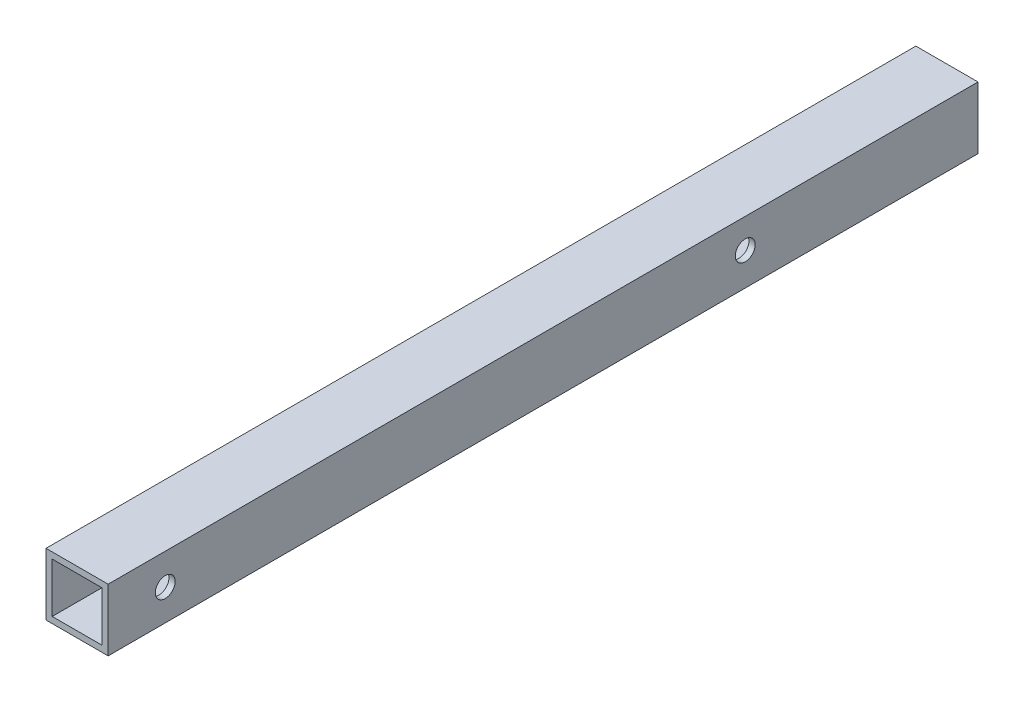
ISO-10303-21;
HEADER;
FILE_DESCRIPTION(('STEP AP214'),'2;1');
FILE_NAME('part.step','',(''),(''),'','','');
FILE_SCHEMA(('AUTOMOTIVE_DESIGN { 1 0 10303 214 1 1 1 1 }'));
ENDSEC;
DATA;
#1=APPLICATION_CONTEXT('core data for automotive mechanical design processes');
#2=APPLICATION_PROTOCOL_DEFINITION('international standard','automotive_design',2000,#1);
#3=PRODUCT_CONTEXT('',#1,'mechanical');
#4=PRODUCT('Part','Part','',(#3));
#5=PRODUCT_RELATED_PRODUCT_CATEGORY('part','',(#4));
#6=PRODUCT_DEFINITION_FORMATION('','',#4);
#7=PRODUCT_DEFINITION_CONTEXT('part definition',#1,'design');
#8=PRODUCT_DEFINITION('design','',#6,#7);
#9=PRODUCT_DEFINITION_SHAPE('','',#8);
#10=(LENGTH_UNIT() NAMED_UNIT(*) SI_UNIT(.MILLI.,.METRE.));
#11=(NAMED_UNIT(*) PLANE_ANGLE_UNIT() SI_UNIT($,.RADIAN.));
#12=(NAMED_UNIT(*) SI_UNIT($,.STERADIAN.) SOLID_ANGLE_UNIT());
#13=UNCERTAINTY_MEASURE_WITH_UNIT(LENGTH_MEASURE(1.E-05),#10,'distance_accuracy_value','');
#14=(GEOMETRIC_REPRESENTATION_CONTEXT(3) GLOBAL_UNCERTAINTY_ASSIGNED_CONTEXT((#13)) GLOBAL_UNIT_ASSIGNED_CONTEXT((#10,
#11,#12)) REPRESENTATION_CONTEXT('',''));
#15=CARTESIAN_POINT('',(0.,0.,0.));
#16=DIRECTION('',(0.,0.,1.));
#17=DIRECTION('',(1.,0.,0.));
#18=AXIS2_PLACEMENT_3D('',#15,#16,#17);
#19=CARTESIAN_POINT('',(0.,0.,140.));
#20=DIRECTION('',(0.,0.,1.));
#21=DIRECTION('',(1.,0.,0.));
#22=AXIS2_PLACEMENT_3D('',#19,#20,#21);
#23=PLANE('',#22);
#24=DIRECTION('',(0.,1.,0.));
#25=VECTOR('',#24,1.);
#26=CARTESIAN_POINT('',(5.,5.,140.));
#27=LINE('',#26,#25);
#28=CARTESIAN_POINT('',(5.,-5.,140.));
#29=VERTEX_POINT('',#28);
#30=CARTESIAN_POINT('',(5.,5.,140.));
#31=VERTEX_POINT('',#30);
#32=EDGE_CURVE('E140',#29,#31,#27,.T.);
#33=ORIENTED_EDGE('',*,*,#32,.T.);
#34=DIRECTION('',(-1.,0.,0.));
#35=VECTOR('',#34,1.);
#36=CARTESIAN_POINT('',(-5.,5.,140.));
#37=LINE('',#36,#35);
#38=CARTESIAN_POINT('',(-5.,5.,140.));
#39=VERTEX_POINT('',#38);
#40=EDGE_CURVE('E143',#31,#39,#37,.T.);
#41=ORIENTED_EDGE('',*,*,#40,.T.);
#42=DIRECTION('',(0.,-1.,0.));
#43=VECTOR('',#42,1.);
#44=CARTESIAN_POINT('',(-5.,5.,140.));
#45=LINE('',#44,#43);
#46=CARTESIAN_POINT('',(-5.,-5.,140.));
#47=VERTEX_POINT('',#46);
#48=EDGE_CURVE('E146',#39,#47,#45,.T.);
#49=ORIENTED_EDGE('',*,*,#48,.T.);
#50=DIRECTION('',(1.,0.,0.));
#51=VECTOR('',#50,1.);
#52=CARTESIAN_POINT('',(-5.,-5.,140.));
#53=LINE('',#52,#51);
#54=EDGE_CURVE('E148',#47,#29,#53,.T.);
#55=ORIENTED_EDGE('',*,*,#54,.T.);
#56=EDGE_LOOP('',(#33,#41,#49,#55));
#57=FACE_BOUND('',#56,.T.);
#58=DIRECTION('',(0.,-1.,0.));
#59=VECTOR('',#58,1.);
#60=CARTESIAN_POINT('',(-4.,4.,140.));
#61=LINE('',#60,#59);
#62=CARTESIAN_POINT('',(-4.,4.,140.));
#63=VERTEX_POINT('',#62);
#64=CARTESIAN_POINT('',(-4.,-4.,140.));
#65=VERTEX_POINT('',#64);
#66=EDGE_CURVE('E110',#63,#65,#61,.T.);
#67=ORIENTED_EDGE('',*,*,#66,.F.);
#68=DIRECTION('',(-1.,0.,0.));
#69=VECTOR('',#68,1.);
#70=CARTESIAN_POINT('',(-4.,4.,140.));
#71=LINE('',#70,#69);
#72=CARTESIAN_POINT('',(4.,4.,140.));
#73=VERTEX_POINT('',#72);
#74=EDGE_CURVE('E102',#73,#63,#71,.T.);
#75=ORIENTED_EDGE('',*,*,#74,.F.);
#76=DIRECTION('',(0.,1.,0.));
#77=VECTOR('',#76,1.);
#78=CARTESIAN_POINT('',(4.,4.,140.));
#79=LINE('',#78,#77);
#80=CARTESIAN_POINT('',(4.,-4.,140.));
#81=VERTEX_POINT('',#80);
#82=EDGE_CURVE('E124',#81,#73,#79,.T.);
#83=ORIENTED_EDGE('',*,*,#82,.F.);
#84=DIRECTION('',(1.,0.,0.));
#85=VECTOR('',#84,1.);
#86=CARTESIAN_POINT('',(-4.,-4.,140.));
#87=LINE('',#86,#85);
#88=EDGE_CURVE('E122',#65,#81,#87,.T.);
#89=ORIENTED_EDGE('',*,*,#88,.F.);
#90=EDGE_LOOP('',(#67,#75,#83,#89));
#91=FACE_BOUND('',#90,.T.);
#92=ADVANCED_FACE('F35',(#57,#91),#23,.T.);
#93=CARTESIAN_POINT('',(0.,0.,0.));
#94=DIRECTION('',(0.,0.,1.));
#95=DIRECTION('',(1.,0.,0.));
#96=AXIS2_PLACEMENT_3D('',#93,#94,#95);
#97=PLANE('',#96);
#98=DIRECTION('',(0.,1.,0.));
#99=VECTOR('',#98,1.);
#100=CARTESIAN_POINT('',(5.,5.,0.));
#101=LINE('',#100,#99);
#102=CARTESIAN_POINT('',(5.,-5.,0.));
#103=VERTEX_POINT('',#102);
#104=CARTESIAN_POINT('',(5.,5.,0.));
#105=VERTEX_POINT('',#104);
#106=EDGE_CURVE('E118',#103,#105,#101,.T.);
#107=ORIENTED_EDGE('',*,*,#106,.F.);
#108=DIRECTION('',(1.,0.,0.));
#109=VECTOR('',#108,1.);
#110=CARTESIAN_POINT('',(-5.,-5.,0.));
#111=LINE('',#110,#109);
#112=CARTESIAN_POINT('',(-5.,-5.,0.));
#113=VERTEX_POINT('',#112);
#114=EDGE_CURVE('E144',#113,#103,#111,.T.);
#115=ORIENTED_EDGE('',*,*,#114,.F.);
#116=DIRECTION('',(0.,-1.,0.));
#117=VECTOR('',#116,1.);
#118=CARTESIAN_POINT('',(-5.,5.,0.));
#119=LINE('',#118,#117);
#120=CARTESIAN_POINT('',(-5.,5.,0.));
#121=VERTEX_POINT('',#120);
#122=EDGE_CURVE('E155',#121,#113,#119,.T.);
#123=ORIENTED_EDGE('',*,*,#122,.F.);
#124=DIRECTION('',(-1.,0.,0.));
#125=VECTOR('',#124,1.);
#126=CARTESIAN_POINT('',(-5.,5.,0.));
#127=LINE('',#126,#125);
#128=EDGE_CURVE('E153',#105,#121,#127,.T.);
#129=ORIENTED_EDGE('',*,*,#128,.F.);
#130=EDGE_LOOP('',(#107,#115,#123,#129));
#131=FACE_BOUND('',#130,.T.);
#132=DIRECTION('',(-1.,0.,0.));
#133=VECTOR('',#132,1.);
#134=CARTESIAN_POINT('',(-4.,4.,0.));
#135=LINE('',#134,#133);
#136=CARTESIAN_POINT('',(4.,4.,0.));
#137=VERTEX_POINT('',#136);
#138=CARTESIAN_POINT('',(-4.,4.,0.));
#139=VERTEX_POINT('',#138);
#140=EDGE_CURVE('E60',#137,#139,#135,.T.);
#141=ORIENTED_EDGE('',*,*,#140,.T.);
#142=DIRECTION('',(0.,-1.,0.));
#143=VECTOR('',#142,1.);
#144=CARTESIAN_POINT('',(-4.,4.,0.));
#145=LINE('',#144,#143);
#146=CARTESIAN_POINT('',(-4.,-4.,0.));
#147=VERTEX_POINT('',#146);
#148=EDGE_CURVE('E117',#139,#147,#145,.T.);
#149=ORIENTED_EDGE('',*,*,#148,.T.);
#150=DIRECTION('',(1.,0.,0.));
#151=VECTOR('',#150,1.);
#152=CARTESIAN_POINT('',(-4.,-4.,0.));
#153=LINE('',#152,#151);
#154=CARTESIAN_POINT('',(4.,-4.,0.));
#155=VERTEX_POINT('',#154);
#156=EDGE_CURVE('E132',#147,#155,#153,.T.);
#157=ORIENTED_EDGE('',*,*,#156,.T.);
#158=DIRECTION('',(0.,1.,0.));
#159=VECTOR('',#158,1.);
#160=CARTESIAN_POINT('',(4.,4.,0.));
#161=LINE('',#160,#159);
#162=EDGE_CURVE('E111',#155,#137,#161,.T.);
#163=ORIENTED_EDGE('',*,*,#162,.T.);
#164=EDGE_LOOP('',(#141,#149,#157,#163));
#165=FACE_BOUND('',#164,.T.);
#166=ADVANCED_FACE('F202',(#131,#165),#97,.F.);
#167=CARTESIAN_POINT('',(5.,5.,140.));
#168=DIRECTION('',(-1.,0.,0.));
#169=DIRECTION('',(0.,-1.,0.));
#170=AXIS2_PLACEMENT_3D('',#167,#168,#169);
#171=PLANE('',#170);
#172=CARTESIAN_POINT('',(5.,0.258526647001551,37.4651202136092));
#173=DIRECTION('',(1.,0.,0.));
#174=DIRECTION('',(0.,1.,0.));
#175=AXIS2_PLACEMENT_3D('',#172,#173,#174);
#176=CIRCLE('',#175,1.59999999999999);
#177=CARTESIAN_POINT('',(5.,1.85852664700154,37.4651202136092));
#178=VERTEX_POINT('',#177);
#179=EDGE_CURVE('E181',#178,#178,#176,.T.);
#180=ORIENTED_EDGE('',*,*,#179,.F.);
#181=EDGE_LOOP('',(#180));
#182=FACE_BOUND('',#181,.T.);
#183=CARTESIAN_POINT('',(5.,0.,130.81));
#184=DIRECTION('',(1.,0.,0.));
#185=DIRECTION('',(0.,1.,0.));
#186=AXIS2_PLACEMENT_3D('',#183,#184,#185);
#187=CIRCLE('',#186,1.60000000000002);
#188=CARTESIAN_POINT('',(5.,1.60000000000002,130.81));
#189=VERTEX_POINT('',#188);
#190=EDGE_CURVE('E171',#189,#189,#187,.T.);
#191=ORIENTED_EDGE('',*,*,#190,.F.);
#192=EDGE_LOOP('',(#191));
#193=FACE_BOUND('',#192,.T.);
#194=ORIENTED_EDGE('',*,*,#106,.T.);
#195=DIRECTION('',(0.,0.,-1.));
#196=VECTOR('',#195,1.);
#197=CARTESIAN_POINT('',(5.,5.,140.));
#198=LINE('',#197,#196);
#199=EDGE_CURVE('E11',#31,#105,#198,.T.);
#200=ORIENTED_EDGE('',*,*,#199,.F.);
#201=ORIENTED_EDGE('',*,*,#32,.F.);
#202=DIRECTION('',(0.,0.,-1.));
#203=VECTOR('',#202,1.);
#204=CARTESIAN_POINT('',(5.,-5.,140.));
#205=LINE('',#204,#203);
#206=EDGE_CURVE('E150',#29,#103,#205,.T.);
#207=ORIENTED_EDGE('',*,*,#206,.T.);
#208=EDGE_LOOP('',(#194,#200,#201,#207));
#209=FACE_BOUND('',#208,.T.);
#210=ADVANCED_FACE('F37',(#182,#193,#209),#171,.F.);
#211=CARTESIAN_POINT('',(-5.,5.,140.));
#212=DIRECTION('',(0.,-1.,0.));
#213=DIRECTION('',(0.,0.,-1.));
#214=AXIS2_PLACEMENT_3D('',#211,#212,#213);
#215=PLANE('',#214);
#216=ORIENTED_EDGE('',*,*,#128,.T.);
#217=DIRECTION('',(0.,0.,-1.));
#218=VECTOR('',#217,1.);
#219=CARTESIAN_POINT('',(-5.,5.,140.));
#220=LINE('',#219,#218);
#221=EDGE_CURVE('E44',#39,#121,#220,.T.);
#222=ORIENTED_EDGE('',*,*,#221,.F.);
#223=ORIENTED_EDGE('',*,*,#40,.F.);
#224=ORIENTED_EDGE('',*,*,#199,.T.);
#225=EDGE_LOOP('',(#216,#222,#223,#224));
#226=FACE_BOUND('',#225,.T.);
#227=ADVANCED_FACE('F229',(#226),#215,.F.);
#228=CARTESIAN_POINT('',(-5.,5.,140.));
#229=DIRECTION('',(1.,0.,0.));
#230=DIRECTION('',(0.,1.,0.));
#231=AXIS2_PLACEMENT_3D('',#228,#229,#230);
#232=PLANE('',#231);
#233=CARTESIAN_POINT('',(-5.00000000000001,0.258526647001549,37.4651202136092));
#234=DIRECTION('',(1.,0.,0.));
#235=DIRECTION('',(0.,1.,0.));
#236=AXIS2_PLACEMENT_3D('',#233,#234,#235);
#237=CIRCLE('',#236,1.59999999999999);
#238=CARTESIAN_POINT('',(-5.00000000000001,1.85852664700154,37.4651202136092));
#239=VERTEX_POINT('',#238);
#240=EDGE_CURVE('E184',#239,#239,#237,.T.);
#241=ORIENTED_EDGE('',*,*,#240,.T.);
#242=EDGE_LOOP('',(#241));
#243=FACE_BOUND('',#242,.T.);
#244=CARTESIAN_POINT('',(-5.,0.,130.81));
#245=DIRECTION('',(1.,0.,0.));
#246=DIRECTION('',(0.,1.,0.));
#247=AXIS2_PLACEMENT_3D('',#244,#245,#246);
#248=CIRCLE('',#247,1.60000000000002);
#249=CARTESIAN_POINT('',(-5.,1.60000000000002,130.81));
#250=VERTEX_POINT('',#249);
#251=EDGE_CURVE('E166',#250,#250,#248,.T.);
#252=ORIENTED_EDGE('',*,*,#251,.T.);
#253=EDGE_LOOP('',(#252));
#254=FACE_BOUND('',#253,.T.);
#255=ORIENTED_EDGE('',*,*,#122,.T.);
#256=DIRECTION('',(0.,0.,-1.));
#257=VECTOR('',#256,1.);
#258=CARTESIAN_POINT('',(-5.,-5.,140.));
#259=LINE('',#258,#257);
#260=EDGE_CURVE('E160',#47,#113,#259,.T.);
#261=ORIENTED_EDGE('',*,*,#260,.F.);
#262=ORIENTED_EDGE('',*,*,#48,.F.);
#263=ORIENTED_EDGE('',*,*,#221,.T.);
#264=EDGE_LOOP('',(#255,#261,#262,#263));
#265=FACE_BOUND('',#264,.T.);
#266=ADVANCED_FACE('F226',(#243,#254,#265),#232,.F.);
#267=CARTESIAN_POINT('',(-5.,-5.,140.));
#268=DIRECTION('',(0.,1.,0.));
#269=DIRECTION('',(0.,0.,1.));
#270=AXIS2_PLACEMENT_3D('',#267,#268,#269);
#271=PLANE('',#270);
#272=ORIENTED_EDGE('',*,*,#114,.T.);
#273=ORIENTED_EDGE('',*,*,#206,.F.);
#274=ORIENTED_EDGE('',*,*,#54,.F.);
#275=ORIENTED_EDGE('',*,*,#260,.T.);
#276=EDGE_LOOP('',(#272,#273,#274,#275));
#277=FACE_BOUND('',#276,.T.);
#278=ADVANCED_FACE('F223',(#277),#271,.F.);
#279=CARTESIAN_POINT('',(-4.,4.,140.));
#280=DIRECTION('',(0.,-1.,0.));
#281=DIRECTION('',(0.,0.,-1.));
#282=AXIS2_PLACEMENT_3D('',#279,#280,#281);
#283=PLANE('',#282);
#284=ORIENTED_EDGE('',*,*,#140,.F.);
#285=DIRECTION('',(0.,0.,-1.));
#286=VECTOR('',#285,1.);
#287=CARTESIAN_POINT('',(4.,4.,140.));
#288=LINE('',#287,#286);
#289=EDGE_CURVE('E106',#73,#137,#288,.T.);
#290=ORIENTED_EDGE('',*,*,#289,.F.);
#291=ORIENTED_EDGE('',*,*,#74,.T.);
#292=DIRECTION('',(0.,0.,-1.));
#293=VECTOR('',#292,1.);
#294=CARTESIAN_POINT('',(-4.,4.,140.));
#295=LINE('',#294,#293);
#296=EDGE_CURVE('E105',#63,#139,#295,.T.);
#297=ORIENTED_EDGE('',*,*,#296,.T.);
#298=EDGE_LOOP('',(#284,#290,#291,#297));
#299=FACE_BOUND('',#298,.T.);
#300=ADVANCED_FACE('F104',(#299),#283,.T.);
#301=CARTESIAN_POINT('',(-4.,4.,140.));
#302=DIRECTION('',(1.,0.,0.));
#303=DIRECTION('',(0.,1.,0.));
#304=AXIS2_PLACEMENT_3D('',#301,#302,#303);
#305=PLANE('',#304);
#306=CARTESIAN_POINT('',(-4.,0.258526647001549,37.4651202136092));
#307=DIRECTION('',(1.,0.,0.));
#308=DIRECTION('',(0.,1.,0.));
#309=AXIS2_PLACEMENT_3D('',#306,#307,#308);
#310=CIRCLE('',#309,1.59999999999999);
#311=CARTESIAN_POINT('',(-4.,1.85852664700154,37.4651202136092));
#312=VERTEX_POINT('',#311);
#313=EDGE_CURVE('E176',#312,#312,#310,.T.);
#314=ORIENTED_EDGE('',*,*,#313,.F.);
#315=EDGE_LOOP('',(#314));
#316=FACE_BOUND('',#315,.T.);
#317=CARTESIAN_POINT('',(-4.,0.,130.81));
#318=DIRECTION('',(1.,0.,0.));
#319=DIRECTION('',(0.,1.,0.));
#320=AXIS2_PLACEMENT_3D('',#317,#318,#319);
#321=CIRCLE('',#320,1.60000000000002);
#322=CARTESIAN_POINT('',(-4.,1.60000000000002,130.81));
#323=VERTEX_POINT('',#322);
#324=EDGE_CURVE('E130',#323,#323,#321,.T.);
#325=ORIENTED_EDGE('',*,*,#324,.F.);
#326=EDGE_LOOP('',(#325));
#327=FACE_BOUND('',#326,.T.);
#328=ORIENTED_EDGE('',*,*,#148,.F.);
#329=ORIENTED_EDGE('',*,*,#296,.F.);
#330=ORIENTED_EDGE('',*,*,#66,.T.);
#331=DIRECTION('',(0.,0.,-1.));
#332=VECTOR('',#331,1.);
#333=CARTESIAN_POINT('',(-4.,-4.,140.));
#334=LINE('',#333,#332);
#335=EDGE_CURVE('E119',#65,#147,#334,.T.);
#336=ORIENTED_EDGE('',*,*,#335,.T.);
#337=EDGE_LOOP('',(#328,#329,#330,#336));
#338=FACE_BOUND('',#337,.T.);
#339=ADVANCED_FACE('F114',(#316,#327,#338),#305,.T.);
#340=CARTESIAN_POINT('',(-4.,-4.,140.));
#341=DIRECTION('',(0.,1.,0.));
#342=DIRECTION('',(-1.,0.,0.));
#343=AXIS2_PLACEMENT_3D('',#340,#341,#342);
#344=PLANE('',#343);
#345=ORIENTED_EDGE('',*,*,#156,.F.);
#346=ORIENTED_EDGE('',*,*,#335,.F.);
#347=ORIENTED_EDGE('',*,*,#88,.T.);
#348=DIRECTION('',(0.,0.,-1.));
#349=VECTOR('',#348,1.);
#350=CARTESIAN_POINT('',(4.,-4.,140.));
#351=LINE('',#350,#349);
#352=EDGE_CURVE('E52',#81,#155,#351,.T.);
#353=ORIENTED_EDGE('',*,*,#352,.T.);
#354=EDGE_LOOP('',(#345,#346,#347,#353));
#355=FACE_BOUND('',#354,.T.);
#356=ADVANCED_FACE('F198',(#355),#344,.T.);
#357=CARTESIAN_POINT('',(4.,4.,140.));
#358=DIRECTION('',(-1.,0.,0.));
#359=DIRECTION('',(0.,-1.,0.));
#360=AXIS2_PLACEMENT_3D('',#357,#358,#359);
#361=PLANE('',#360);
#362=CARTESIAN_POINT('',(4.,0.25852664700155,37.4651202136092));
#363=DIRECTION('',(-1.,0.,0.));
#364=DIRECTION('',(0.,-1.,0.));
#365=AXIS2_PLACEMENT_3D('',#362,#363,#364);
#366=CIRCLE('',#365,1.59999999999999);
#367=CARTESIAN_POINT('',(4.,-1.34147335299844,37.4651202136092));
#368=VERTEX_POINT('',#367);
#369=EDGE_CURVE('E39',#368,#368,#366,.T.);
#370=ORIENTED_EDGE('',*,*,#369,.F.);
#371=EDGE_LOOP('',(#370));
#372=FACE_BOUND('',#371,.T.);
#373=CARTESIAN_POINT('',(4.,0.,130.81));
#374=DIRECTION('',(-1.,0.,0.));
#375=DIRECTION('',(0.,-1.,0.));
#376=AXIS2_PLACEMENT_3D('',#373,#374,#375);
#377=CIRCLE('',#376,1.60000000000002);
#378=CARTESIAN_POINT('',(4.,1.60000000000002,130.81));
#379=VERTEX_POINT('',#378);
#380=EDGE_CURVE('E164',#379,#379,#377,.T.);
#381=ORIENTED_EDGE('',*,*,#380,.F.);
#382=EDGE_LOOP('',(#381));
#383=FACE_BOUND('',#382,.T.);
#384=ORIENTED_EDGE('',*,*,#162,.F.);
#385=ORIENTED_EDGE('',*,*,#352,.F.);
#386=ORIENTED_EDGE('',*,*,#82,.T.);
#387=ORIENTED_EDGE('',*,*,#289,.T.);
#388=EDGE_LOOP('',(#384,#385,#386,#387));
#389=FACE_BOUND('',#388,.T.);
#390=ADVANCED_FACE('F194',(#372,#383,#389),#361,.T.);
#391=CARTESIAN_POINT('',(-5.,0.,130.81));
#392=DIRECTION('',(1.,0.,0.));
#393=DIRECTION('',(0.,1.,0.));
#394=AXIS2_PLACEMENT_3D('',#391,#392,#393);
#395=CYLINDRICAL_SURFACE('',#394,1.60000000000002);
#396=CARTESIAN_POINT('',(4.,1.60000000000002,130.81));
#397=CARTESIAN_POINT('',(4.01041666666667,1.60000000000002,130.81));
#398=CARTESIAN_POINT('',(4.02083333333333,1.60000000000002,130.81));
#399=CARTESIAN_POINT('',(4.04166666666667,1.60000000000002,130.81));
#400=CARTESIAN_POINT('',(4.05208333333333,1.60000000000002,130.81));
#401=CARTESIAN_POINT('',(4.07291666666667,1.60000000000002,130.81));
#402=CARTESIAN_POINT('',(4.08333333333333,1.60000000000002,130.81));
#403=CARTESIAN_POINT('',(4.10416666666667,1.60000000000002,130.81));
#404=CARTESIAN_POINT('',(4.11458333333333,1.60000000000002,130.81));
#405=CARTESIAN_POINT('',(4.13541666666667,1.60000000000002,130.81));
#406=CARTESIAN_POINT('',(4.14583333333333,1.60000000000002,130.81));
#407=CARTESIAN_POINT('',(4.16666666666667,1.60000000000002,130.81));
#408=CARTESIAN_POINT('',(4.17708333333333,1.60000000000002,130.81));
#409=CARTESIAN_POINT('',(4.19791666666667,1.60000000000002,130.81));
#410=CARTESIAN_POINT('',(4.20833333333333,1.60000000000002,130.81));
#411=CARTESIAN_POINT('',(4.22916666666667,1.60000000000002,130.81));
#412=CARTESIAN_POINT('',(4.23958333333333,1.60000000000002,130.81));
#413=CARTESIAN_POINT('',(4.26041666666667,1.60000000000002,130.81));
#414=CARTESIAN_POINT('',(4.27083333333333,1.60000000000002,130.81));
#415=CARTESIAN_POINT('',(4.29166666666667,1.60000000000002,130.81));
#416=CARTESIAN_POINT('',(4.30208333333333,1.60000000000002,130.81));
#417=CARTESIAN_POINT('',(4.32291666666667,1.60000000000002,130.81));
#418=CARTESIAN_POINT('',(4.33333333333333,1.60000000000002,130.81));
#419=CARTESIAN_POINT('',(4.35416666666667,1.60000000000002,130.81));
#420=CARTESIAN_POINT('',(4.36458333333333,1.60000000000002,130.81));
#421=CARTESIAN_POINT('',(4.38541666666667,1.60000000000002,130.81));
#422=CARTESIAN_POINT('',(4.39583333333333,1.60000000000002,130.81));
#423=CARTESIAN_POINT('',(4.41666666666667,1.60000000000002,130.81));
#424=CARTESIAN_POINT('',(4.42708333333333,1.60000000000002,130.81));
#425=CARTESIAN_POINT('',(4.44791666666667,1.60000000000002,130.81));
#426=CARTESIAN_POINT('',(4.45833333333333,1.60000000000002,130.81));
#427=CARTESIAN_POINT('',(4.47916666666667,1.60000000000002,130.81));
#428=CARTESIAN_POINT('',(4.48958333333333,1.60000000000002,130.81));
#429=CARTESIAN_POINT('',(4.51041666666667,1.60000000000002,130.81));
#430=CARTESIAN_POINT('',(4.52083333333333,1.60000000000002,130.81));
#431=CARTESIAN_POINT('',(4.54166666666667,1.60000000000002,130.81));
#432=CARTESIAN_POINT('',(4.55208333333333,1.60000000000002,130.81));
#433=CARTESIAN_POINT('',(4.57291666666667,1.60000000000002,130.81));
#434=CARTESIAN_POINT('',(4.58333333333333,1.60000000000002,130.81));
#435=CARTESIAN_POINT('',(4.60416666666667,1.60000000000002,130.81));
#436=CARTESIAN_POINT('',(4.61458333333333,1.60000000000002,130.81));
#437=CARTESIAN_POINT('',(4.63541666666667,1.60000000000002,130.81));
#438=CARTESIAN_POINT('',(4.64583333333333,1.60000000000002,130.81));
#439=CARTESIAN_POINT('',(4.66666666666667,1.60000000000002,130.81));
#440=CARTESIAN_POINT('',(4.67708333333333,1.60000000000002,130.81));
#441=CARTESIAN_POINT('',(4.69791666666667,1.60000000000002,130.81));
#442=CARTESIAN_POINT('',(4.70833333333333,1.60000000000002,130.81));
#443=CARTESIAN_POINT('',(4.72916666666667,1.60000000000002,130.81));
#444=CARTESIAN_POINT('',(4.73958333333333,1.60000000000002,130.81));
#445=CARTESIAN_POINT('',(4.76041666666667,1.60000000000002,130.81));
#446=CARTESIAN_POINT('',(4.77083333333333,1.60000000000002,130.81));
#447=CARTESIAN_POINT('',(4.79166666666667,1.60000000000002,130.81));
#448=CARTESIAN_POINT('',(4.80208333333333,1.60000000000002,130.81));
#449=CARTESIAN_POINT('',(4.82291666666667,1.60000000000002,130.81));
#450=CARTESIAN_POINT('',(4.83333333333333,1.60000000000002,130.81));
#451=CARTESIAN_POINT('',(4.85416666666667,1.60000000000002,130.81));
#452=CARTESIAN_POINT('',(4.86458333333333,1.60000000000002,130.81));
#453=CARTESIAN_POINT('',(4.88541666666667,1.60000000000002,130.81));
#454=CARTESIAN_POINT('',(4.89583333333333,1.60000000000002,130.81));
#455=CARTESIAN_POINT('',(4.91666666666667,1.60000000000002,130.81));
#456=CARTESIAN_POINT('',(4.92708333333333,1.60000000000002,130.81));
#457=CARTESIAN_POINT('',(4.94791666666667,1.60000000000002,130.81));
#458=CARTESIAN_POINT('',(4.95833333333333,1.60000000000002,130.81));
#459=CARTESIAN_POINT('',(4.97916666666667,1.60000000000002,130.81));
#460=CARTESIAN_POINT('',(4.98958333333333,1.60000000000002,130.81));
#461=CARTESIAN_POINT('',(5.,1.60000000000002,130.81));
#462=B_SPLINE_CURVE_WITH_KNOTS('',3,(#396,#397,#398,#399,#400,#401,#402,#403,#404,#405,#406,
#407,#408,#409,#410,#411,#412,#413,#414,#415,#416,#417,#418,#419,#420,#421,#422,#423,#424,#425,
#426,#427,#428,#429,#430,#431,#432,#433,#434,#435,#436,#437,#438,#439,#440,#441,#442,#443,#444,
#445,#446,#447,#448,#449,#450,#451,#452,#453,#454,#455,#456,#457,#458,#459,#460,#461),
.UNSPECIFIED.,.F.,.F.,(4,2,2,2,2,2,2,2,2,2,2,2,2,2,2,2,2,2,2,2,2,2,2,2,2,2,2,2,2,2,2,2,4),(0.,
0.03125,0.0625000000000001,0.0937500000000001,0.125,0.15625,0.1875,0.21875,0.25,0.28125,0.3125,
0.34375,0.375,0.40625,0.4375,0.46875,0.5,0.53125,0.5625,0.593750000000001,0.625000000000001,
0.656250000000001,0.687500000000001,0.718750000000001,0.750000000000001,0.781250000000001,
0.812500000000001,0.843750000000001,0.875000000000001,0.906250000000001,0.937500000000001,
0.968750000000001,1.),.UNSPECIFIED.);
#463=EDGE_CURVE('BSEAM197',#379,#189,#462,.T.);
#464=ORIENTED_EDGE('',*,*,#380,.T.);
#465=ORIENTED_EDGE('',*,*,#190,.T.);
#466=ORIENTED_EDGE('',*,*,#463,.T.);
#467=ORIENTED_EDGE('',*,*,#463,.F.);
#468=EDGE_LOOP('',(#464,#466,#465,#467));
#469=FACE_BOUND('',#468,.T.);
#470=ADVANCED_FACE('F197',(#469),#395,.F.);
#471=CARTESIAN_POINT('',(-4.,1.60000000000002,130.81));
#472=CARTESIAN_POINT('',(-4.01041666666667,1.60000000000002,130.81));
#473=CARTESIAN_POINT('',(-4.02083333333333,1.60000000000002,130.81));
#474=CARTESIAN_POINT('',(-4.04166666666667,1.60000000000002,130.81));
#475=CARTESIAN_POINT('',(-4.05208333333333,1.60000000000002,130.81));
#476=CARTESIAN_POINT('',(-4.07291666666667,1.60000000000002,130.81));
#477=CARTESIAN_POINT('',(-4.08333333333333,1.60000000000002,130.81));
#478=CARTESIAN_POINT('',(-4.10416666666667,1.60000000000002,130.81));
#479=CARTESIAN_POINT('',(-4.11458333333333,1.60000000000002,130.81));
#480=CARTESIAN_POINT('',(-4.13541666666667,1.60000000000002,130.81));
#481=CARTESIAN_POINT('',(-4.14583333333333,1.60000000000002,130.81));
#482=CARTESIAN_POINT('',(-4.16666666666667,1.60000000000002,130.81));
#483=CARTESIAN_POINT('',(-4.17708333333333,1.60000000000002,130.81));
#484=CARTESIAN_POINT('',(-4.19791666666667,1.60000000000002,130.81));
#485=CARTESIAN_POINT('',(-4.20833333333333,1.60000000000002,130.81));
#486=CARTESIAN_POINT('',(-4.22916666666667,1.60000000000002,130.81));
#487=CARTESIAN_POINT('',(-4.23958333333333,1.60000000000002,130.81));
#488=CARTESIAN_POINT('',(-4.26041666666667,1.60000000000002,130.81));
#489=CARTESIAN_POINT('',(-4.27083333333333,1.60000000000002,130.81));
#490=CARTESIAN_POINT('',(-4.29166666666667,1.60000000000002,130.81));
#491=CARTESIAN_POINT('',(-4.30208333333334,1.60000000000002,130.81));
#492=CARTESIAN_POINT('',(-4.32291666666667,1.60000000000002,130.81));
#493=CARTESIAN_POINT('',(-4.33333333333334,1.60000000000002,130.81));
#494=CARTESIAN_POINT('',(-4.35416666666667,1.60000000000002,130.81));
#495=CARTESIAN_POINT('',(-4.36458333333334,1.60000000000002,130.81));
#496=CARTESIAN_POINT('',(-4.38541666666667,1.60000000000002,130.81));
#497=CARTESIAN_POINT('',(-4.39583333333334,1.60000000000002,130.81));
#498=CARTESIAN_POINT('',(-4.41666666666667,1.60000000000002,130.81));
#499=CARTESIAN_POINT('',(-4.42708333333334,1.60000000000002,130.81));
#500=CARTESIAN_POINT('',(-4.44791666666667,1.60000000000002,130.81));
#501=CARTESIAN_POINT('',(-4.45833333333334,1.60000000000002,130.81));
#502=CARTESIAN_POINT('',(-4.47916666666667,1.60000000000002,130.81));
#503=CARTESIAN_POINT('',(-4.48958333333334,1.60000000000002,130.81));
#504=CARTESIAN_POINT('',(-4.51041666666667,1.60000000000002,130.81));
#505=CARTESIAN_POINT('',(-4.52083333333334,1.60000000000002,130.81));
#506=CARTESIAN_POINT('',(-4.54166666666667,1.60000000000002,130.81));
#507=CARTESIAN_POINT('',(-4.55208333333334,1.60000000000002,130.81));
#508=CARTESIAN_POINT('',(-4.57291666666667,1.60000000000002,130.81));
#509=CARTESIAN_POINT('',(-4.58333333333334,1.60000000000002,130.81));
#510=CARTESIAN_POINT('',(-4.60416666666667,1.60000000000002,130.81));
#511=CARTESIAN_POINT('',(-4.61458333333334,1.60000000000002,130.81));
#512=CARTESIAN_POINT('',(-4.63541666666667,1.60000000000002,130.81));
#513=CARTESIAN_POINT('',(-4.64583333333334,1.60000000000002,130.81));
#514=CARTESIAN_POINT('',(-4.66666666666667,1.60000000000002,130.81));
#515=CARTESIAN_POINT('',(-4.67708333333334,1.60000000000002,130.81));
#516=CARTESIAN_POINT('',(-4.69791666666667,1.60000000000002,130.81));
#517=CARTESIAN_POINT('',(-4.70833333333334,1.60000000000002,130.81));
#518=CARTESIAN_POINT('',(-4.72916666666667,1.60000000000002,130.81));
#519=CARTESIAN_POINT('',(-4.73958333333334,1.60000000000002,130.81));
#520=CARTESIAN_POINT('',(-4.76041666666667,1.60000000000002,130.81));
#521=CARTESIAN_POINT('',(-4.77083333333334,1.60000000000002,130.81));
#522=CARTESIAN_POINT('',(-4.79166666666667,1.60000000000002,130.81));
#523=CARTESIAN_POINT('',(-4.80208333333334,1.60000000000002,130.81));
#524=CARTESIAN_POINT('',(-4.82291666666667,1.60000000000002,130.81));
#525=CARTESIAN_POINT('',(-4.83333333333334,1.60000000000002,130.81));
#526=CARTESIAN_POINT('',(-4.85416666666667,1.60000000000002,130.81));
#527=CARTESIAN_POINT('',(-4.86458333333334,1.60000000000002,130.81));
#528=CARTESIAN_POINT('',(-4.88541666666667,1.60000000000002,130.81));
#529=CARTESIAN_POINT('',(-4.89583333333334,1.60000000000002,130.81));
#530=CARTESIAN_POINT('',(-4.91666666666667,1.60000000000002,130.81));
#531=CARTESIAN_POINT('',(-4.92708333333334,1.60000000000002,130.81));
#532=CARTESIAN_POINT('',(-4.94791666666667,1.60000000000002,130.81));
#533=CARTESIAN_POINT('',(-4.95833333333334,1.60000000000002,130.81));
#534=CARTESIAN_POINT('',(-4.97916666666667,1.60000000000002,130.81));
#535=CARTESIAN_POINT('',(-4.98958333333334,1.60000000000002,130.81));
#536=CARTESIAN_POINT('',(-5.,1.60000000000002,130.81));
#537=B_SPLINE_CURVE_WITH_KNOTS('',3,(#471,#472,#473,#474,#475,#476,#477,#478,#479,#480,#481,
#482,#483,#484,#485,#486,#487,#488,#489,#490,#491,#492,#493,#494,#495,#496,#497,#498,#499,#500,
#501,#502,#503,#504,#505,#506,#507,#508,#509,#510,#511,#512,#513,#514,#515,#516,#517,#518,#519,
#520,#521,#522,#523,#524,#525,#526,#527,#528,#529,#530,#531,#532,#533,#534,#535,#536),
.UNSPECIFIED.,.F.,.F.,(4,2,2,2,2,2,2,2,2,2,2,2,2,2,2,2,2,2,2,2,2,2,2,2,2,2,2,2,2,2,2,2,4),(0.,
0.03125,0.0625000000000001,0.0937500000000001,0.125,0.15625,0.1875,0.21875,0.25,
0.281250000000001,0.312500000000001,0.343750000000001,0.375000000000001,0.406250000000001,
0.437500000000001,0.468750000000001,0.500000000000001,0.531250000000001,0.562500000000001,
0.593750000000001,0.625000000000001,0.656250000000002,0.687500000000002,0.718750000000002,
0.750000000000002,0.781250000000002,0.812500000000002,0.843750000000002,0.875000000000003,
0.906250000000003,0.937500000000003,0.968750000000003,1.),.UNSPECIFIED.);
#538=EDGE_CURVE('BSEAM257',#323,#250,#537,.T.);
#539=ORIENTED_EDGE('',*,*,#324,.T.);
#540=ORIENTED_EDGE('',*,*,#251,.F.);
#541=ORIENTED_EDGE('',*,*,#538,.T.);
#542=ORIENTED_EDGE('',*,*,#538,.F.);
#543=EDGE_LOOP('',(#539,#541,#540,#542));
#544=FACE_BOUND('',#543,.T.);
#545=ADVANCED_FACE('F257',(#544),#395,.F.);
#546=CARTESIAN_POINT('',(-5.00000000000001,0.258526647001549,37.4651202136092));
#547=DIRECTION('',(1.,0.,0.));
#548=DIRECTION('',(0.,1.,0.));
#549=AXIS2_PLACEMENT_3D('',#546,#547,#548);
#550=CYLINDRICAL_SURFACE('',#549,1.59999999999999);
#551=ORIENTED_EDGE('',*,*,#369,.T.);
#552=EDGE_LOOP('',(#551));
#553=FACE_BOUND('',#552,.T.);
#554=ORIENTED_EDGE('',*,*,#179,.T.);
#555=EDGE_LOOP('',(#554));
#556=FACE_BOUND('',#555,.T.);
#557=ADVANCED_FACE('F191',(#553,#556),#550,.F.);
#558=ORIENTED_EDGE('',*,*,#313,.T.);
#559=EDGE_LOOP('',(#558));
#560=FACE_BOUND('',#559,.T.);
#561=ORIENTED_EDGE('',*,*,#240,.F.);
#562=EDGE_LOOP('',(#561));
#563=FACE_BOUND('',#562,.T.);
#564=ADVANCED_FACE('F265',(#560,#563),#550,.F.);
#565=CLOSED_SHELL('',(#92,#166,#210,#227,#266,#278,#300,#339,#356,#390,#470,#545,#557,#564));
#566=MANIFOLD_SOLID_BREP('B2',#565);
#567=ADVANCED_BREP_SHAPE_REPRESENTATION('',(#18,#566),#14);
#568=SHAPE_DEFINITION_REPRESENTATION(#9,#567);
ENDSEC;
END-ISO-10303-21;
